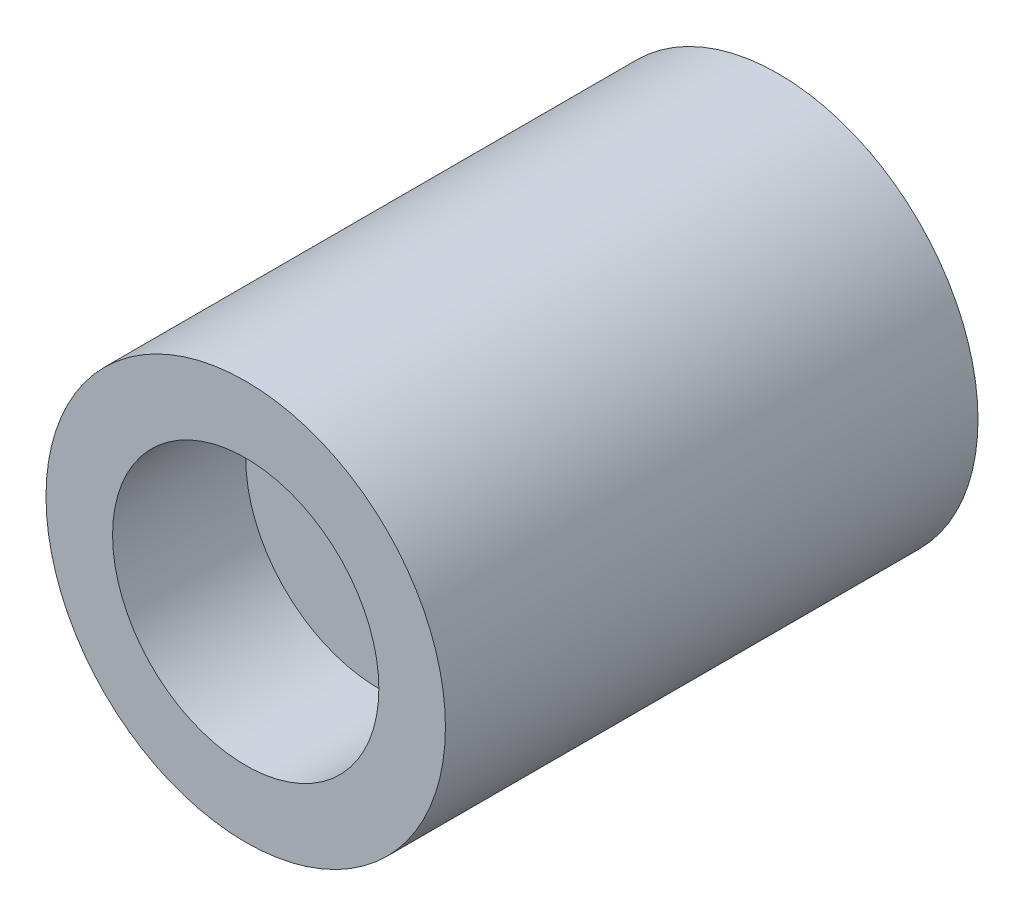
ISO-10303-21;
HEADER;
FILE_DESCRIPTION(('STEP AP214'),'2;1');
FILE_NAME('part.step','',(''),(''),'','','');
FILE_SCHEMA(('AUTOMOTIVE_DESIGN { 1 0 10303 214 1 1 1 1 }'));
ENDSEC;
DATA;
#1=APPLICATION_CONTEXT('core data for automotive mechanical design processes');
#2=APPLICATION_PROTOCOL_DEFINITION('international standard','automotive_design',2000,#1);
#3=PRODUCT_CONTEXT('',#1,'mechanical');
#4=PRODUCT('Part','Part','',(#3));
#5=PRODUCT_RELATED_PRODUCT_CATEGORY('part','',(#4));
#6=PRODUCT_DEFINITION_FORMATION('','',#4);
#7=PRODUCT_DEFINITION_CONTEXT('part definition',#1,'design');
#8=PRODUCT_DEFINITION('design','',#6,#7);
#9=PRODUCT_DEFINITION_SHAPE('','',#8);
#10=(LENGTH_UNIT() NAMED_UNIT(*) SI_UNIT(.MILLI.,.METRE.));
#11=(NAMED_UNIT(*) PLANE_ANGLE_UNIT() SI_UNIT($,.RADIAN.));
#12=(NAMED_UNIT(*) SI_UNIT($,.STERADIAN.) SOLID_ANGLE_UNIT());
#13=UNCERTAINTY_MEASURE_WITH_UNIT(LENGTH_MEASURE(1.E-05),#10,'distance_accuracy_value','');
#14=(GEOMETRIC_REPRESENTATION_CONTEXT(3) GLOBAL_UNCERTAINTY_ASSIGNED_CONTEXT((#13)) GLOBAL_UNIT_ASSIGNED_CONTEXT((#10,
#11,#12)) REPRESENTATION_CONTEXT('',''));
#15=CARTESIAN_POINT('',(0.,0.,0.));
#16=DIRECTION('',(0.,0.,1.));
#17=DIRECTION('',(1.,0.,0.));
#18=AXIS2_PLACEMENT_3D('',#15,#16,#17);
#19=CARTESIAN_POINT('',(0.,0.,8.));
#20=DIRECTION('',(0.,0.,-1.));
#21=DIRECTION('',(-1.,0.,0.));
#22=AXIS2_PLACEMENT_3D('',#19,#20,#21);
#23=CYLINDRICAL_SURFACE('',#22,3.);
#24=CARTESIAN_POINT('',(0.,0.,8.));
#25=DIRECTION('',(0.,0.,1.));
#26=DIRECTION('',(1.,0.,0.));
#27=AXIS2_PLACEMENT_3D('',#24,#25,#26);
#28=CIRCLE('',#27,3.);
#29=CARTESIAN_POINT('',(3.,0.,8.));
#30=VERTEX_POINT('',#29);
#31=EDGE_CURVE('E10',#30,#30,#28,.T.);
#32=ORIENTED_EDGE('',*,*,#31,.F.);
#33=EDGE_LOOP('',(#32));
#34=FACE_BOUND('',#33,.T.);
#35=CARTESIAN_POINT('',(0.,0.,0.));
#36=DIRECTION('',(0.,0.,1.));
#37=DIRECTION('',(1.,0.,0.));
#38=AXIS2_PLACEMENT_3D('',#35,#36,#37);
#39=CIRCLE('',#38,3.);
#40=CARTESIAN_POINT('',(3.,0.,0.));
#41=VERTEX_POINT('',#40);
#42=EDGE_CURVE('E44',#41,#41,#39,.T.);
#43=ORIENTED_EDGE('',*,*,#42,.T.);
#44=EDGE_LOOP('',(#43));
#45=FACE_BOUND('',#44,.T.);
#46=ADVANCED_FACE('F41',(#34,#45),#23,.T.);
#47=CARTESIAN_POINT('',(0.,0.,8.));
#48=DIRECTION('',(0.,0.,1.));
#49=DIRECTION('',(1.,0.,0.));
#50=AXIS2_PLACEMENT_3D('',#47,#48,#49);
#51=PLANE('',#50);
#52=CARTESIAN_POINT('',(0.,0.,8.));
#53=DIRECTION('',(0.,0.,1.));
#54=DIRECTION('',(1.,0.,0.));
#55=AXIS2_PLACEMENT_3D('',#52,#53,#54);
#56=CIRCLE('',#55,2.);
#57=CARTESIAN_POINT('',(2.,0.,8.));
#58=VERTEX_POINT('',#57);
#59=EDGE_CURVE('E53',#58,#58,#56,.T.);
#60=ORIENTED_EDGE('',*,*,#59,.F.);
#61=EDGE_LOOP('',(#60));
#62=FACE_BOUND('',#61,.T.);
#63=ORIENTED_EDGE('',*,*,#31,.T.);
#64=EDGE_LOOP('',(#63));
#65=FACE_BOUND('',#64,.T.);
#66=ADVANCED_FACE('F77',(#62,#65),#51,.T.);
#67=CARTESIAN_POINT('',(0.,0.,0.));
#68=DIRECTION('',(0.,0.,1.));
#69=DIRECTION('',(1.,0.,0.));
#70=AXIS2_PLACEMENT_3D('',#67,#68,#69);
#71=PLANE('',#70);
#72=CARTESIAN_POINT('',(0.,0.,0.));
#73=DIRECTION('',(0.,0.,1.));
#74=DIRECTION('',(1.,0.,0.));
#75=AXIS2_PLACEMENT_3D('',#72,#73,#74);
#76=CIRCLE('',#75,1.2);
#77=CARTESIAN_POINT('',(1.2,0.,0.));
#78=VERTEX_POINT('',#77);
#79=EDGE_CURVE('E59',#78,#78,#76,.T.);
#80=ORIENTED_EDGE('',*,*,#79,.T.);
#81=EDGE_LOOP('',(#80));
#82=FACE_BOUND('',#81,.T.);
#83=ORIENTED_EDGE('',*,*,#42,.F.);
#84=EDGE_LOOP('',(#83));
#85=FACE_BOUND('',#84,.T.);
#86=ADVANCED_FACE('F82',(#82,#85),#71,.F.);
#87=CARTESIAN_POINT('',(0.,0.,6.));
#88=DIRECTION('',(0.,0.,1.));
#89=DIRECTION('',(1.,0.,0.));
#90=AXIS2_PLACEMENT_3D('',#87,#88,#89);
#91=CYLINDRICAL_SURFACE('',#90,2.);
#92=CARTESIAN_POINT('',(0.,0.,6.));
#93=DIRECTION('',(0.,0.,1.));
#94=DIRECTION('',(1.,0.,0.));
#95=AXIS2_PLACEMENT_3D('',#92,#93,#94);
#96=CIRCLE('',#95,2.);
#97=CARTESIAN_POINT('',(2.,0.,6.));
#98=VERTEX_POINT('',#97);
#99=EDGE_CURVE('E51',#98,#98,#96,.T.);
#100=ORIENTED_EDGE('',*,*,#99,.F.);
#101=EDGE_LOOP('',(#100));
#102=FACE_BOUND('',#101,.T.);
#103=ORIENTED_EDGE('',*,*,#59,.T.);
#104=EDGE_LOOP('',(#103));
#105=FACE_BOUND('',#104,.T.);
#106=ADVANCED_FACE('F89',(#102,#105),#91,.F.);
#107=CARTESIAN_POINT('',(0.,0.,6.));
#108=DIRECTION('',(0.,0.,1.));
#109=DIRECTION('',(1.,0.,0.));
#110=AXIS2_PLACEMENT_3D('',#107,#108,#109);
#111=PLANE('',#110);
#112=ORIENTED_EDGE('',*,*,#99,.T.);
#113=EDGE_LOOP('',(#112));
#114=FACE_BOUND('',#113,.T.);
#115=ADVANCED_FACE('F74',(#114),#111,.T.);
#116=CARTESIAN_POINT('',(0.,0.,5.));
#117=DIRECTION('',(0.,0.,-1.));
#118=DIRECTION('',(-1.,0.,0.));
#119=AXIS2_PLACEMENT_3D('',#116,#117,#118);
#120=CYLINDRICAL_SURFACE('',#119,1.2);
#121=CARTESIAN_POINT('',(0.,0.,5.));
#122=DIRECTION('',(0.,0.,1.));
#123=DIRECTION('',(1.,0.,0.));
#124=AXIS2_PLACEMENT_3D('',#121,#122,#123);
#125=CIRCLE('',#124,1.2);
#126=CARTESIAN_POINT('',(1.2,0.,5.));
#127=VERTEX_POINT('',#126);
#128=EDGE_CURVE('E56',#127,#127,#125,.T.);
#129=ORIENTED_EDGE('',*,*,#128,.T.);
#130=EDGE_LOOP('',(#129));
#131=FACE_BOUND('',#130,.T.);
#132=ORIENTED_EDGE('',*,*,#79,.F.);
#133=EDGE_LOOP('',(#132));
#134=FACE_BOUND('',#133,.T.);
#135=ADVANCED_FACE('F65',(#131,#134),#120,.F.);
#136=CARTESIAN_POINT('',(0.,0.,5.));
#137=DIRECTION('',(0.,0.,1.));
#138=DIRECTION('',(1.,0.,0.));
#139=AXIS2_PLACEMENT_3D('',#136,#137,#138);
#140=PLANE('',#139);
#141=ORIENTED_EDGE('',*,*,#128,.F.);
#142=EDGE_LOOP('',(#141));
#143=FACE_BOUND('',#142,.T.);
#144=ADVANCED_FACE('F68',(#143),#140,.F.);
#145=CLOSED_SHELL('',(#46,#66,#86,#106,#115,#135,#144));
#146=MANIFOLD_SOLID_BREP('B2',#145);
#147=ADVANCED_BREP_SHAPE_REPRESENTATION('',(#18,#146),#14);
#148=SHAPE_DEFINITION_REPRESENTATION(#9,#147);
ENDSEC;
END-ISO-10303-21;
